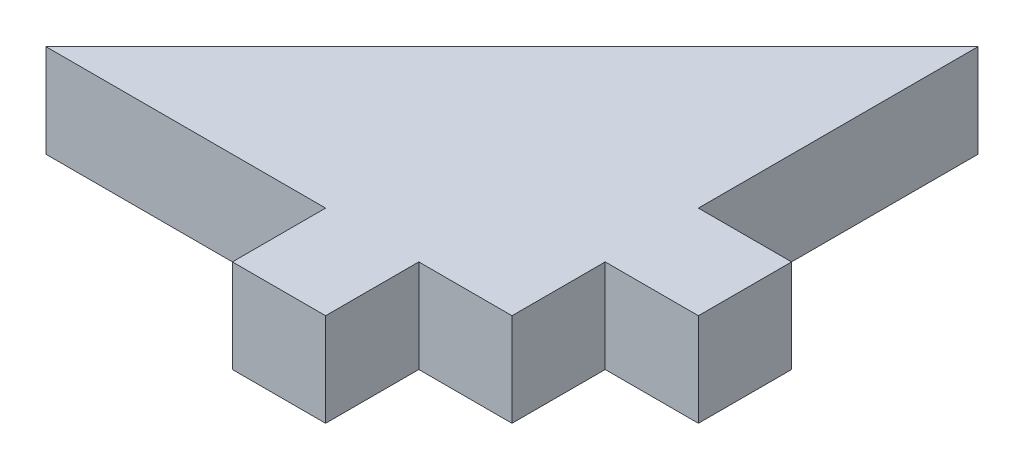
ISO-10303-21;
HEADER;
FILE_DESCRIPTION(('STEP AP214'),'2;1');
FILE_NAME('part.step','',(''),(''),'','','');
FILE_SCHEMA(('AUTOMOTIVE_DESIGN { 1 0 10303 214 1 1 1 1 }'));
ENDSEC;
DATA;
#1=APPLICATION_CONTEXT('core data for automotive mechanical design processes');
#2=APPLICATION_PROTOCOL_DEFINITION('international standard','automotive_design',2000,#1);
#3=PRODUCT_CONTEXT('',#1,'mechanical');
#4=PRODUCT('Part','Part','',(#3));
#5=PRODUCT_RELATED_PRODUCT_CATEGORY('part','',(#4));
#6=PRODUCT_DEFINITION_FORMATION('','',#4);
#7=PRODUCT_DEFINITION_CONTEXT('part definition',#1,'design');
#8=PRODUCT_DEFINITION('design','',#6,#7);
#9=PRODUCT_DEFINITION_SHAPE('','',#8);
#10=(LENGTH_UNIT() NAMED_UNIT(*) SI_UNIT(.MILLI.,.METRE.));
#11=(NAMED_UNIT(*) PLANE_ANGLE_UNIT() SI_UNIT($,.RADIAN.));
#12=(NAMED_UNIT(*) SI_UNIT($,.STERADIAN.) SOLID_ANGLE_UNIT());
#13=UNCERTAINTY_MEASURE_WITH_UNIT(LENGTH_MEASURE(1.E-05),#10,'distance_accuracy_value','');
#14=(GEOMETRIC_REPRESENTATION_CONTEXT(3) GLOBAL_UNCERTAINTY_ASSIGNED_CONTEXT((#13)) GLOBAL_UNIT_ASSIGNED_CONTEXT((#10,
#11,#12)) REPRESENTATION_CONTEXT('',''));
#15=CARTESIAN_POINT('',(0.,0.,0.));
#16=DIRECTION('',(0.,0.,1.));
#17=DIRECTION('',(1.,0.,0.));
#18=AXIS2_PLACEMENT_3D('',#15,#16,#17);
#19=CARTESIAN_POINT('',(-1.11022302462516E-13,2.54,0.));
#20=DIRECTION('',(-1.,0.,0.));
#21=DIRECTION('',(0.,0.,1.));
#22=AXIS2_PLACEMENT_3D('',#19,#20,#21);
#23=PLANE('',#22);
#24=DIRECTION('',(0.,1.,0.));
#25=VECTOR('',#24,1.);
#26=CARTESIAN_POINT('',(0.,0.,-5.08));
#27=LINE('',#26,#25);
#28=CARTESIAN_POINT('',(0.,0.,-5.08));
#29=VERTEX_POINT('',#28);
#30=CARTESIAN_POINT('',(-1.11022302462516E-13,2.54,-5.08));
#31=VERTEX_POINT('',#30);
#32=EDGE_CURVE('E208',#29,#31,#27,.T.);
#33=ORIENTED_EDGE('',*,*,#32,.F.);
#34=DIRECTION('',(0.,0.,-1.));
#35=VECTOR('',#34,1.);
#36=CARTESIAN_POINT('',(0.,0.,0.));
#37=LINE('',#36,#35);
#38=CARTESIAN_POINT('',(0.,0.,-12.7));
#39=VERTEX_POINT('',#38);
#40=EDGE_CURVE('E142',#29,#39,#37,.T.);
#41=ORIENTED_EDGE('',*,*,#40,.T.);
#42=DIRECTION('',(0.,-1.,0.));
#43=VECTOR('',#42,1.);
#44=CARTESIAN_POINT('',(-1.11022302462516E-13,2.54,-12.7));
#45=LINE('',#44,#43);
#46=CARTESIAN_POINT('',(-1.11022302462516E-13,2.54,-12.7));
#47=VERTEX_POINT('',#46);
#48=EDGE_CURVE('E42',#47,#39,#45,.T.);
#49=ORIENTED_EDGE('',*,*,#48,.F.);
#50=DIRECTION('',(0.,0.,-1.));
#51=VECTOR('',#50,1.);
#52=CARTESIAN_POINT('',(-1.11022302462516E-13,2.54,0.));
#53=LINE('',#52,#51);
#54=EDGE_CURVE('E174',#31,#47,#53,.T.);
#55=ORIENTED_EDGE('',*,*,#54,.F.);
#56=EDGE_LOOP('',(#33,#41,#49,#55));
#57=FACE_BOUND('',#56,.T.);
#58=ADVANCED_FACE('F33',(#57),#23,.F.);
#59=CARTESIAN_POINT('',(-12.7000000000001,2.54,0.));
#60=DIRECTION('',(0.,0.,-1.));
#61=DIRECTION('',(-1.,0.,0.));
#62=AXIS2_PLACEMENT_3D('',#59,#60,#61);
#63=PLANE('',#62);
#64=DIRECTION('',(0.,1.,0.));
#65=VECTOR('',#64,1.);
#66=CARTESIAN_POINT('',(-2.54000000000006,0.,0.));
#67=LINE('',#66,#65);
#68=CARTESIAN_POINT('',(-2.54000000000006,0.,0.));
#69=VERTEX_POINT('',#68);
#70=CARTESIAN_POINT('',(-2.54000000000006,2.54,0.));
#71=VERTEX_POINT('',#70);
#72=EDGE_CURVE('E218',#69,#71,#67,.T.);
#73=ORIENTED_EDGE('',*,*,#72,.F.);
#74=DIRECTION('',(1.,0.,0.));
#75=VECTOR('',#74,1.);
#76=CARTESIAN_POINT('',(-12.7000000000001,0.,0.));
#77=LINE('',#76,#75);
#78=CARTESIAN_POINT('',(0.,0.,0.));
#79=VERTEX_POINT('',#78);
#80=EDGE_CURVE('E167',#69,#79,#77,.T.);
#81=ORIENTED_EDGE('',*,*,#80,.T.);
#82=DIRECTION('',(0.,-1.,0.));
#83=VECTOR('',#82,1.);
#84=CARTESIAN_POINT('',(-1.11022302462516E-13,2.54,0.));
#85=LINE('',#84,#83);
#86=CARTESIAN_POINT('',(-1.11022302462516E-13,2.54,0.));
#87=VERTEX_POINT('',#86);
#88=EDGE_CURVE('E11',#87,#79,#85,.T.);
#89=ORIENTED_EDGE('',*,*,#88,.F.);
#90=DIRECTION('',(1.,0.,0.));
#91=VECTOR('',#90,1.);
#92=CARTESIAN_POINT('',(-12.7000000000001,2.54,0.));
#93=LINE('',#92,#91);
#94=EDGE_CURVE('E144',#71,#87,#93,.T.);
#95=ORIENTED_EDGE('',*,*,#94,.F.);
#96=EDGE_LOOP('',(#73,#81,#89,#95));
#97=FACE_BOUND('',#96,.T.);
#98=ADVANCED_FACE('F266',(#97),#63,.F.);
#99=CARTESIAN_POINT('',(-12.7000000000001,0.,0.));
#100=VERTEX_POINT('',#99);
#101=CARTESIAN_POINT('',(-5.08000000000006,0.,0.));
#102=VERTEX_POINT('',#101);
#103=EDGE_CURVE('E146',#100,#102,#77,.T.);
#104=ORIENTED_EDGE('',*,*,#103,.T.);
#105=DIRECTION('',(0.,1.,0.));
#106=VECTOR('',#105,1.);
#107=CARTESIAN_POINT('',(-5.08000000000006,0.,0.));
#108=LINE('',#107,#106);
#109=CARTESIAN_POINT('',(-5.08000000000006,2.54,0.));
#110=VERTEX_POINT('',#109);
#111=EDGE_CURVE('E169',#102,#110,#108,.T.);
#112=ORIENTED_EDGE('',*,*,#111,.T.);
#113=CARTESIAN_POINT('',(-12.7000000000001,2.54,0.));
#114=VERTEX_POINT('',#113);
#115=EDGE_CURVE('E170',#114,#110,#93,.T.);
#116=ORIENTED_EDGE('',*,*,#115,.F.);
#117=DIRECTION('',(0.,-1.,0.));
#118=VECTOR('',#117,1.);
#119=CARTESIAN_POINT('',(-12.7000000000001,2.54,0.));
#120=LINE('',#119,#118);
#121=EDGE_CURVE('E159',#114,#100,#120,.T.);
#122=ORIENTED_EDGE('',*,*,#121,.T.);
#123=EDGE_LOOP('',(#104,#112,#116,#122));
#124=FACE_BOUND('',#123,.T.);
#125=ADVANCED_FACE('F35',(#124),#63,.F.);
#126=CARTESIAN_POINT('',(0.,0.,-2.54));
#127=VERTEX_POINT('',#126);
#128=EDGE_CURVE('E133',#79,#127,#37,.T.);
#129=ORIENTED_EDGE('',*,*,#128,.T.);
#130=DIRECTION('',(0.,1.,0.));
#131=VECTOR('',#130,1.);
#132=CARTESIAN_POINT('',(0.,0.,-2.54));
#133=LINE('',#132,#131);
#134=CARTESIAN_POINT('',(-1.11022302462516E-13,2.54,-2.54));
#135=VERTEX_POINT('',#134);
#136=EDGE_CURVE('E116',#127,#135,#133,.T.);
#137=ORIENTED_EDGE('',*,*,#136,.T.);
#138=EDGE_CURVE('E186',#87,#135,#53,.T.);
#139=ORIENTED_EDGE('',*,*,#138,.F.);
#140=ORIENTED_EDGE('',*,*,#88,.T.);
#141=EDGE_LOOP('',(#129,#137,#139,#140));
#142=FACE_BOUND('',#141,.T.);
#143=ADVANCED_FACE('F139',(#142),#23,.F.);
#144=CARTESIAN_POINT('',(-1.11022302462516E-13,2.54,-12.7));
#145=DIRECTION('',(0.707106781186548,0.,0.707106781186548));
#146=DIRECTION('',(0.707106781186548,0.,-0.707106781186548));
#147=AXIS2_PLACEMENT_3D('',#144,#145,#146);
#148=PLANE('',#147);
#149=DIRECTION('',(-0.707106781186547,0.,0.707106781186547));
#150=VECTOR('',#149,1.);
#151=CARTESIAN_POINT('',(0.,0.,-12.7));
#152=LINE('',#151,#150);
#153=EDGE_CURVE('E141',#39,#100,#152,.T.);
#154=ORIENTED_EDGE('',*,*,#153,.T.);
#155=ORIENTED_EDGE('',*,*,#121,.F.);
#156=DIRECTION('',(-0.707106781186547,0.,0.707106781186547));
#157=VECTOR('',#156,1.);
#158=CARTESIAN_POINT('',(-1.11022302462516E-13,2.54,-12.7));
#159=LINE('',#158,#157);
#160=EDGE_CURVE('E162',#47,#114,#159,.T.);
#161=ORIENTED_EDGE('',*,*,#160,.F.);
#162=ORIENTED_EDGE('',*,*,#48,.T.);
#163=EDGE_LOOP('',(#154,#155,#161,#162));
#164=FACE_BOUND('',#163,.T.);
#165=ADVANCED_FACE('F201',(#164),#148,.F.);
#166=CARTESIAN_POINT('',(-1.11022302462516E-13,2.54,0.));
#167=DIRECTION('',(0.,1.,0.));
#168=DIRECTION('',(0.,0.,1.));
#169=AXIS2_PLACEMENT_3D('',#166,#167,#168);
#170=PLANE('',#169);
#171=ORIENTED_EDGE('',*,*,#115,.T.);
#172=DIRECTION('',(0.,0.,1.));
#173=VECTOR('',#172,1.);
#174=CARTESIAN_POINT('',(-5.08000000000006,2.54,0.));
#175=LINE('',#174,#173);
#176=CARTESIAN_POINT('',(-5.08000000000006,2.54,2.54));
#177=VERTEX_POINT('',#176);
#178=EDGE_CURVE('E58',#110,#177,#175,.T.);
#179=ORIENTED_EDGE('',*,*,#178,.T.);
#180=DIRECTION('',(1.,0.,0.));
#181=VECTOR('',#180,1.);
#182=CARTESIAN_POINT('',(-5.08000000000006,2.54,2.54));
#183=LINE('',#182,#181);
#184=CARTESIAN_POINT('',(-2.54000000000006,2.54,2.54));
#185=VERTEX_POINT('',#184);
#186=EDGE_CURVE('E207',#177,#185,#183,.T.);
#187=ORIENTED_EDGE('',*,*,#186,.T.);
#188=DIRECTION('',(0.,0.,-1.));
#189=VECTOR('',#188,1.);
#190=CARTESIAN_POINT('',(-2.54000000000006,2.54,0.));
#191=LINE('',#190,#189);
#192=EDGE_CURVE('E209',#185,#71,#191,.T.);
#193=ORIENTED_EDGE('',*,*,#192,.T.);
#194=ORIENTED_EDGE('',*,*,#94,.T.);
#195=ORIENTED_EDGE('',*,*,#138,.T.);
#196=DIRECTION('',(1.,0.,0.));
#197=VECTOR('',#196,1.);
#198=CARTESIAN_POINT('',(-1.11022302462516E-13,2.54,-2.54));
#199=LINE('',#198,#197);
#200=CARTESIAN_POINT('',(2.54,2.54,-2.54));
#201=VERTEX_POINT('',#200);
#202=EDGE_CURVE('E50',#135,#201,#199,.T.);
#203=ORIENTED_EDGE('',*,*,#202,.T.);
#204=DIRECTION('',(0.,0.,-1.));
#205=VECTOR('',#204,1.);
#206=CARTESIAN_POINT('',(2.54,2.54,-5.08));
#207=LINE('',#206,#205);
#208=CARTESIAN_POINT('',(2.54,2.54,-5.08));
#209=VERTEX_POINT('',#208);
#210=EDGE_CURVE('E253',#201,#209,#207,.T.);
#211=ORIENTED_EDGE('',*,*,#210,.T.);
#212=DIRECTION('',(-1.,0.,0.));
#213=VECTOR('',#212,1.);
#214=CARTESIAN_POINT('',(-1.11022302462516E-13,2.54,-5.08));
#215=LINE('',#214,#213);
#216=EDGE_CURVE('E137',#209,#31,#215,.T.);
#217=ORIENTED_EDGE('',*,*,#216,.T.);
#218=ORIENTED_EDGE('',*,*,#54,.T.);
#219=ORIENTED_EDGE('',*,*,#160,.T.);
#220=EDGE_LOOP('',(#171,#179,#187,#193,#194,#195,#203,#211,#217,#218,#219));
#221=FACE_BOUND('',#220,.T.);
#222=ADVANCED_FACE('F191',(#221),#170,.T.);
#223=CARTESIAN_POINT('',(0.,0.,0.));
#224=DIRECTION('',(0.,1.,0.));
#225=DIRECTION('',(0.,0.,1.));
#226=AXIS2_PLACEMENT_3D('',#223,#224,#225);
#227=PLANE('',#226);
#228=ORIENTED_EDGE('',*,*,#103,.F.);
#229=ORIENTED_EDGE('',*,*,#153,.F.);
#230=ORIENTED_EDGE('',*,*,#40,.F.);
#231=DIRECTION('',(-1.,0.,0.));
#232=VECTOR('',#231,1.);
#233=CARTESIAN_POINT('',(0.,0.,-5.08));
#234=LINE('',#233,#232);
#235=CARTESIAN_POINT('',(2.54,0.,-5.08));
#236=VERTEX_POINT('',#235);
#237=EDGE_CURVE('E125',#236,#29,#234,.T.);
#238=ORIENTED_EDGE('',*,*,#237,.F.);
#239=DIRECTION('',(0.,0.,-1.));
#240=VECTOR('',#239,1.);
#241=CARTESIAN_POINT('',(2.54,0.,-5.08));
#242=LINE('',#241,#240);
#243=CARTESIAN_POINT('',(2.54,0.,-2.54));
#244=VERTEX_POINT('',#243);
#245=EDGE_CURVE('E136',#244,#236,#242,.T.);
#246=ORIENTED_EDGE('',*,*,#245,.F.);
#247=DIRECTION('',(1.,0.,0.));
#248=VECTOR('',#247,1.);
#249=CARTESIAN_POINT('',(0.,0.,-2.54));
#250=LINE('',#249,#248);
#251=EDGE_CURVE('E119',#127,#244,#250,.T.);
#252=ORIENTED_EDGE('',*,*,#251,.F.);
#253=ORIENTED_EDGE('',*,*,#128,.F.);
#254=ORIENTED_EDGE('',*,*,#80,.F.);
#255=DIRECTION('',(0.,0.,-1.));
#256=VECTOR('',#255,1.);
#257=CARTESIAN_POINT('',(-2.54000000000006,0.,0.));
#258=LINE('',#257,#256);
#259=CARTESIAN_POINT('',(-2.54000000000006,0.,2.54));
#260=VERTEX_POINT('',#259);
#261=EDGE_CURVE('E229',#260,#69,#258,.T.);
#262=ORIENTED_EDGE('',*,*,#261,.F.);
#263=DIRECTION('',(1.,0.,0.));
#264=VECTOR('',#263,1.);
#265=CARTESIAN_POINT('',(-5.08000000000006,0.,2.54));
#266=LINE('',#265,#264);
#267=CARTESIAN_POINT('',(-5.08000000000006,0.,2.54));
#268=VERTEX_POINT('',#267);
#269=EDGE_CURVE('E231',#268,#260,#266,.T.);
#270=ORIENTED_EDGE('',*,*,#269,.F.);
#271=DIRECTION('',(0.,0.,1.));
#272=VECTOR('',#271,1.);
#273=CARTESIAN_POINT('',(-5.08000000000006,0.,0.));
#274=LINE('',#273,#272);
#275=EDGE_CURVE('E219',#102,#268,#274,.T.);
#276=ORIENTED_EDGE('',*,*,#275,.F.);
#277=EDGE_LOOP('',(#228,#229,#230,#238,#246,#252,#253,#254,#262,#270,#276));
#278=FACE_BOUND('',#277,.T.);
#279=ADVANCED_FACE('F131',(#278),#227,.F.);
#280=CARTESIAN_POINT('',(-5.08000000000006,0.,0.));
#281=DIRECTION('',(-1.,0.,0.));
#282=DIRECTION('',(0.,0.,1.));
#283=AXIS2_PLACEMENT_3D('',#280,#281,#282);
#284=PLANE('',#283);
#285=ORIENTED_EDGE('',*,*,#178,.F.);
#286=ORIENTED_EDGE('',*,*,#111,.F.);
#287=ORIENTED_EDGE('',*,*,#275,.T.);
#288=DIRECTION('',(0.,1.,0.));
#289=VECTOR('',#288,1.);
#290=CARTESIAN_POINT('',(-5.08000000000006,0.,2.54));
#291=LINE('',#290,#289);
#292=EDGE_CURVE('E179',#268,#177,#291,.T.);
#293=ORIENTED_EDGE('',*,*,#292,.T.);
#294=EDGE_LOOP('',(#285,#286,#287,#293));
#295=FACE_BOUND('',#294,.T.);
#296=ADVANCED_FACE('F285',(#295),#284,.T.);
#297=CARTESIAN_POINT('',(-2.54000000000006,0.,0.));
#298=DIRECTION('',(1.,0.,0.));
#299=DIRECTION('',(0.,0.,-1.));
#300=AXIS2_PLACEMENT_3D('',#297,#298,#299);
#301=PLANE('',#300);
#302=ORIENTED_EDGE('',*,*,#192,.F.);
#303=DIRECTION('',(0.,1.,0.));
#304=VECTOR('',#303,1.);
#305=CARTESIAN_POINT('',(-2.54000000000006,0.,2.54));
#306=LINE('',#305,#304);
#307=EDGE_CURVE('E225',#260,#185,#306,.T.);
#308=ORIENTED_EDGE('',*,*,#307,.F.);
#309=ORIENTED_EDGE('',*,*,#261,.T.);
#310=ORIENTED_EDGE('',*,*,#72,.T.);
#311=EDGE_LOOP('',(#302,#308,#309,#310));
#312=FACE_BOUND('',#311,.T.);
#313=ADVANCED_FACE('F264',(#312),#301,.T.);
#314=CARTESIAN_POINT('',(-5.08000000000006,0.,2.54));
#315=DIRECTION('',(0.,0.,1.));
#316=DIRECTION('',(1.,0.,0.));
#317=AXIS2_PLACEMENT_3D('',#314,#315,#316);
#318=PLANE('',#317);
#319=ORIENTED_EDGE('',*,*,#186,.F.);
#320=ORIENTED_EDGE('',*,*,#292,.F.);
#321=ORIENTED_EDGE('',*,*,#269,.T.);
#322=ORIENTED_EDGE('',*,*,#307,.T.);
#323=EDGE_LOOP('',(#319,#320,#321,#322));
#324=FACE_BOUND('',#323,.T.);
#325=ADVANCED_FACE('F289',(#324),#318,.T.);
#326=CARTESIAN_POINT('',(0.,0.,-5.08));
#327=DIRECTION('',(0.,0.,-1.));
#328=DIRECTION('',(-1.,0.,0.));
#329=AXIS2_PLACEMENT_3D('',#326,#327,#328);
#330=PLANE('',#329);
#331=ORIENTED_EDGE('',*,*,#216,.F.);
#332=DIRECTION('',(0.,1.,0.));
#333=VECTOR('',#332,1.);
#334=CARTESIAN_POINT('',(2.54,0.,-5.08));
#335=LINE('',#334,#333);
#336=EDGE_CURVE('E211',#236,#209,#335,.T.);
#337=ORIENTED_EDGE('',*,*,#336,.F.);
#338=ORIENTED_EDGE('',*,*,#237,.T.);
#339=ORIENTED_EDGE('',*,*,#32,.T.);
#340=EDGE_LOOP('',(#331,#337,#338,#339));
#341=FACE_BOUND('',#340,.T.);
#342=ADVANCED_FACE('F260',(#341),#330,.T.);
#343=CARTESIAN_POINT('',(2.54,0.,-5.08));
#344=DIRECTION('',(1.,0.,0.));
#345=DIRECTION('',(0.,0.,-1.));
#346=AXIS2_PLACEMENT_3D('',#343,#344,#345);
#347=PLANE('',#346);
#348=ORIENTED_EDGE('',*,*,#210,.F.);
#349=DIRECTION('',(0.,1.,0.));
#350=VECTOR('',#349,1.);
#351=CARTESIAN_POINT('',(2.54,0.,-2.54));
#352=LINE('',#351,#350);
#353=EDGE_CURVE('E124',#244,#201,#352,.T.);
#354=ORIENTED_EDGE('',*,*,#353,.F.);
#355=ORIENTED_EDGE('',*,*,#245,.T.);
#356=ORIENTED_EDGE('',*,*,#336,.T.);
#357=EDGE_LOOP('',(#348,#354,#355,#356));
#358=FACE_BOUND('',#357,.T.);
#359=ADVANCED_FACE('F257',(#358),#347,.T.);
#360=CARTESIAN_POINT('',(0.,0.,-2.54));
#361=DIRECTION('',(0.,0.,1.));
#362=DIRECTION('',(1.,0.,0.));
#363=AXIS2_PLACEMENT_3D('',#360,#361,#362);
#364=PLANE('',#363);
#365=ORIENTED_EDGE('',*,*,#202,.F.);
#366=ORIENTED_EDGE('',*,*,#136,.F.);
#367=ORIENTED_EDGE('',*,*,#251,.T.);
#368=ORIENTED_EDGE('',*,*,#353,.T.);
#369=EDGE_LOOP('',(#365,#366,#367,#368));
#370=FACE_BOUND('',#369,.T.);
#371=ADVANCED_FACE('F118',(#370),#364,.T.);
#372=CLOSED_SHELL('',(#58,#98,#125,#143,#165,#222,#279,#296,#313,#325,#342,#359,#371));
#373=MANIFOLD_SOLID_BREP('B2',#372);
#374=ADVANCED_BREP_SHAPE_REPRESENTATION('',(#18,#373),#14);
#375=SHAPE_DEFINITION_REPRESENTATION(#9,#374);
ENDSEC;
END-ISO-10303-21;
